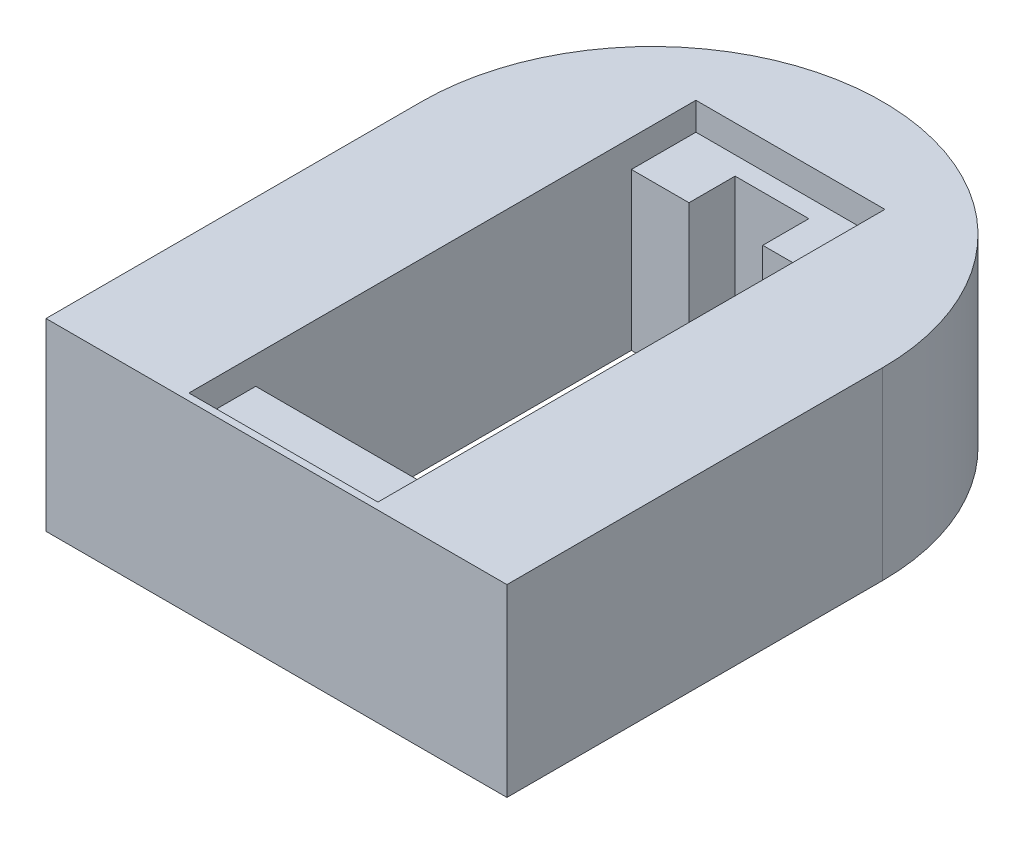
ISO-10303-21;
HEADER;
FILE_DESCRIPTION(('STEP AP214'),'2;1');
FILE_NAME('part.step','',(''),(''),'','','');
FILE_SCHEMA(('AUTOMOTIVE_DESIGN { 1 0 10303 214 1 1 1 1 }'));
ENDSEC;
DATA;
#1=APPLICATION_CONTEXT('core data for automotive mechanical design processes');
#2=APPLICATION_PROTOCOL_DEFINITION('international standard','automotive_design',2000,#1);
#3=PRODUCT_CONTEXT('',#1,'mechanical');
#4=PRODUCT('Part','Part','',(#3));
#5=PRODUCT_RELATED_PRODUCT_CATEGORY('part','',(#4));
#6=PRODUCT_DEFINITION_FORMATION('','',#4);
#7=PRODUCT_DEFINITION_CONTEXT('part definition',#1,'design');
#8=PRODUCT_DEFINITION('design','',#6,#7);
#9=PRODUCT_DEFINITION_SHAPE('','',#8);
#10=(LENGTH_UNIT() NAMED_UNIT(*) SI_UNIT(.MILLI.,.METRE.));
#11=(NAMED_UNIT(*) PLANE_ANGLE_UNIT() SI_UNIT($,.RADIAN.));
#12=(NAMED_UNIT(*) SI_UNIT($,.STERADIAN.) SOLID_ANGLE_UNIT());
#13=UNCERTAINTY_MEASURE_WITH_UNIT(LENGTH_MEASURE(1.E-05),#10,'distance_accuracy_value','');
#14=(GEOMETRIC_REPRESENTATION_CONTEXT(3) GLOBAL_UNCERTAINTY_ASSIGNED_CONTEXT((#13)) GLOBAL_UNIT_ASSIGNED_CONTEXT((#10,
#11,#12)) REPRESENTATION_CONTEXT('',''));
#15=CARTESIAN_POINT('',(0.,0.,0.));
#16=DIRECTION('',(0.,0.,1.));
#17=DIRECTION('',(1.,0.,0.));
#18=AXIS2_PLACEMENT_3D('',#15,#16,#17);
#19=CARTESIAN_POINT('',(0.,20.,0.));
#20=DIRECTION('',(-1.,0.,0.));
#21=DIRECTION('',(0.,0.,1.));
#22=AXIS2_PLACEMENT_3D('',#19,#20,#21);
#23=PLANE('',#22);
#24=DIRECTION('',(0.,0.,-1.));
#25=VECTOR('',#24,1.);
#26=CARTESIAN_POINT('',(0.,0.,0.));
#27=LINE('',#26,#25);
#28=CARTESIAN_POINT('',(0.,0.,0.));
#29=VERTEX_POINT('',#28);
#30=CARTESIAN_POINT('',(0.,0.,-40.75));
#31=VERTEX_POINT('',#30);
#32=EDGE_CURVE('E271',#29,#31,#27,.T.);
#33=ORIENTED_EDGE('',*,*,#32,.F.);
#34=DIRECTION('',(0.,-1.,0.));
#35=VECTOR('',#34,1.);
#36=CARTESIAN_POINT('',(0.,20.,0.));
#37=LINE('',#36,#35);
#38=CARTESIAN_POINT('',(0.,20.,0.));
#39=VERTEX_POINT('',#38);
#40=EDGE_CURVE('E11',#39,#29,#37,.T.);
#41=ORIENTED_EDGE('',*,*,#40,.F.);
#42=DIRECTION('',(0.,0.,-1.));
#43=VECTOR('',#42,1.);
#44=CARTESIAN_POINT('',(0.,20.,0.));
#45=LINE('',#44,#43);
#46=CARTESIAN_POINT('',(0.,20.,-40.75));
#47=VERTEX_POINT('',#46);
#48=EDGE_CURVE('E298',#39,#47,#45,.T.);
#49=ORIENTED_EDGE('',*,*,#48,.T.);
#50=DIRECTION('',(0.,-1.,0.));
#51=VECTOR('',#50,1.);
#52=CARTESIAN_POINT('',(0.,20.,-40.75));
#53=LINE('',#52,#51);
#54=EDGE_CURVE('E46',#47,#31,#53,.T.);
#55=ORIENTED_EDGE('',*,*,#54,.T.);
#56=EDGE_LOOP('',(#33,#41,#49,#55));
#57=FACE_BOUND('',#56,.T.);
#58=ADVANCED_FACE('F43',(#57),#23,.T.);
#59=CARTESIAN_POINT('',(0.,20.,0.));
#60=DIRECTION('',(0.,0.,-1.));
#61=DIRECTION('',(-1.,0.,0.));
#62=AXIS2_PLACEMENT_3D('',#59,#60,#61);
#63=PLANE('',#62);
#64=DIRECTION('',(1.,0.,0.));
#65=VECTOR('',#64,1.);
#66=CARTESIAN_POINT('',(0.,0.,0.));
#67=LINE('',#66,#65);
#68=CARTESIAN_POINT('',(50.,0.,0.));
#69=VERTEX_POINT('',#68);
#70=EDGE_CURVE('E303',#29,#69,#67,.T.);
#71=ORIENTED_EDGE('',*,*,#70,.T.);
#72=DIRECTION('',(0.,-1.,0.));
#73=VECTOR('',#72,1.);
#74=CARTESIAN_POINT('',(50.,20.,0.));
#75=LINE('',#74,#73);
#76=CARTESIAN_POINT('',(50.,20.,0.));
#77=VERTEX_POINT('',#76);
#78=EDGE_CURVE('E52',#77,#69,#75,.T.);
#79=ORIENTED_EDGE('',*,*,#78,.F.);
#80=DIRECTION('',(1.,0.,0.));
#81=VECTOR('',#80,1.);
#82=CARTESIAN_POINT('',(0.,20.,0.));
#83=LINE('',#82,#81);
#84=EDGE_CURVE('E310',#39,#77,#83,.T.);
#85=ORIENTED_EDGE('',*,*,#84,.F.);
#86=ORIENTED_EDGE('',*,*,#40,.T.);
#87=EDGE_LOOP('',(#71,#79,#85,#86));
#88=FACE_BOUND('',#87,.T.);
#89=ADVANCED_FACE('F345',(#88),#63,.F.);
#90=CARTESIAN_POINT('',(50.,20.,0.));
#91=DIRECTION('',(-1.,0.,0.));
#92=DIRECTION('',(0.,0.,1.));
#93=AXIS2_PLACEMENT_3D('',#90,#91,#92);
#94=PLANE('',#93);
#95=DIRECTION('',(0.,0.,-1.));
#96=VECTOR('',#95,1.);
#97=CARTESIAN_POINT('',(50.,0.,0.));
#98=LINE('',#97,#96);
#99=CARTESIAN_POINT('',(50.,0.,-40.75));
#100=VERTEX_POINT('',#99);
#101=EDGE_CURVE('E320',#69,#100,#98,.T.);
#102=ORIENTED_EDGE('',*,*,#101,.T.);
#103=DIRECTION('',(0.,-1.,0.));
#104=VECTOR('',#103,1.);
#105=CARTESIAN_POINT('',(50.,20.,-40.75));
#106=LINE('',#105,#104);
#107=CARTESIAN_POINT('',(50.,20.,-40.75));
#108=VERTEX_POINT('',#107);
#109=EDGE_CURVE('E328',#108,#100,#106,.T.);
#110=ORIENTED_EDGE('',*,*,#109,.F.);
#111=DIRECTION('',(0.,0.,-1.));
#112=VECTOR('',#111,1.);
#113=CARTESIAN_POINT('',(50.,20.,0.));
#114=LINE('',#113,#112);
#115=EDGE_CURVE('E307',#77,#108,#114,.T.);
#116=ORIENTED_EDGE('',*,*,#115,.F.);
#117=ORIENTED_EDGE('',*,*,#78,.T.);
#118=EDGE_LOOP('',(#102,#110,#116,#117));
#119=FACE_BOUND('',#118,.T.);
#120=ADVANCED_FACE('F349',(#119),#94,.F.);
#121=CARTESIAN_POINT('',(25.,20.,-40.75));
#122=DIRECTION('',(0.,-1.,0.));
#123=DIRECTION('',(0.,0.,-1.));
#124=AXIS2_PLACEMENT_3D('',#121,#122,#123);
#125=CYLINDRICAL_SURFACE('',#124,25.);
#126=CARTESIAN_POINT('',(25.,0.,-40.75));
#127=DIRECTION('',(0.,-1.,0.));
#128=DIRECTION('',(0.,0.,-1.));
#129=AXIS2_PLACEMENT_3D('',#126,#127,#128);
#130=CIRCLE('',#129,25.);
#131=EDGE_CURVE('E316',#31,#100,#130,.T.);
#132=ORIENTED_EDGE('',*,*,#131,.F.);
#133=ORIENTED_EDGE('',*,*,#54,.F.);
#134=CARTESIAN_POINT('',(25.,20.,-40.75));
#135=DIRECTION('',(0.,-1.,0.));
#136=DIRECTION('',(0.,0.,-1.));
#137=AXIS2_PLACEMENT_3D('',#134,#135,#136);
#138=CIRCLE('',#137,25.);
#139=EDGE_CURVE('E302',#47,#108,#138,.T.);
#140=ORIENTED_EDGE('',*,*,#139,.T.);
#141=ORIENTED_EDGE('',*,*,#109,.T.);
#142=EDGE_LOOP('',(#132,#133,#140,#141));
#143=FACE_BOUND('',#142,.T.);
#144=ADVANCED_FACE('F338',(#143),#125,.T.);
#145=CARTESIAN_POINT('',(25.,20.,-40.75));
#146=DIRECTION('',(0.,-1.,0.));
#147=DIRECTION('',(0.,0.,-1.));
#148=AXIS2_PLACEMENT_3D('',#145,#146,#147);
#149=PLANE('',#148);
#150=DIRECTION('',(0.,0.,1.));
#151=VECTOR('',#150,1.);
#152=CARTESIAN_POINT('',(14.75,20.,-48.75));
#153=LINE('',#152,#151);
#154=CARTESIAN_POINT('',(14.75,20.,-55.75));
#155=VERTEX_POINT('',#154);
#156=CARTESIAN_POINT('',(14.75,20.,-0.75));
#157=VERTEX_POINT('',#156);
#158=EDGE_CURVE('E229',#155,#157,#153,.T.);
#159=ORIENTED_EDGE('',*,*,#158,.F.);
#160=DIRECTION('',(-1.,0.,0.));
#161=VECTOR('',#160,1.);
#162=CARTESIAN_POINT('',(14.75,20.,-55.75));
#163=LINE('',#162,#161);
#164=CARTESIAN_POINT('',(35.25,20.,-55.75));
#165=VERTEX_POINT('',#164);
#166=EDGE_CURVE('E189',#165,#155,#163,.T.);
#167=ORIENTED_EDGE('',*,*,#166,.F.);
#168=DIRECTION('',(0.,0.,-1.));
#169=VECTOR('',#168,1.);
#170=CARTESIAN_POINT('',(35.25,20.,-8.));
#171=LINE('',#170,#169);
#172=CARTESIAN_POINT('',(35.25,20.,-0.75));
#173=VERTEX_POINT('',#172);
#174=EDGE_CURVE('E161',#173,#165,#171,.T.);
#175=ORIENTED_EDGE('',*,*,#174,.F.);
#176=DIRECTION('',(1.,0.,0.));
#177=VECTOR('',#176,1.);
#178=CARTESIAN_POINT('',(14.75,20.,-0.75));
#179=LINE('',#178,#177);
#180=EDGE_CURVE('E192',#157,#173,#179,.T.);
#181=ORIENTED_EDGE('',*,*,#180,.F.);
#182=EDGE_LOOP('',(#159,#167,#175,#181));
#183=FACE_BOUND('',#182,.T.);
#184=ORIENTED_EDGE('',*,*,#48,.F.);
#185=ORIENTED_EDGE('',*,*,#84,.T.);
#186=ORIENTED_EDGE('',*,*,#115,.T.);
#187=ORIENTED_EDGE('',*,*,#139,.F.);
#188=EDGE_LOOP('',(#184,#185,#186,#187));
#189=FACE_BOUND('',#188,.T.);
#190=ADVANCED_FACE('F351',(#183,#189),#149,.F.);
#191=CARTESIAN_POINT('',(25.,0.,-40.75));
#192=DIRECTION('',(0.,-1.,0.));
#193=DIRECTION('',(0.,0.,-1.));
#194=AXIS2_PLACEMENT_3D('',#191,#192,#193);
#195=PLANE('',#194);
#196=DIRECTION('',(0.,0.,1.));
#197=VECTOR('',#196,1.);
#198=CARTESIAN_POINT('',(14.75,0.,-48.75));
#199=LINE('',#198,#197);
#200=CARTESIAN_POINT('',(14.75,0.,-48.75));
#201=VERTEX_POINT('',#200);
#202=CARTESIAN_POINT('',(14.75,0.,-8.));
#203=VERTEX_POINT('',#202);
#204=EDGE_CURVE('E230',#201,#203,#199,.T.);
#205=ORIENTED_EDGE('',*,*,#204,.T.);
#206=DIRECTION('',(1.,0.,0.));
#207=VECTOR('',#206,1.);
#208=CARTESIAN_POINT('',(14.75,0.,-8.));
#209=LINE('',#208,#207);
#210=CARTESIAN_POINT('',(35.25,0.,-8.));
#211=VERTEX_POINT('',#210);
#212=EDGE_CURVE('E234',#203,#211,#209,.T.);
#213=ORIENTED_EDGE('',*,*,#212,.T.);
#214=DIRECTION('',(0.,0.,-1.));
#215=VECTOR('',#214,1.);
#216=CARTESIAN_POINT('',(35.25,0.,-8.));
#217=LINE('',#216,#215);
#218=CARTESIAN_POINT('',(35.25,0.,-48.75));
#219=VERTEX_POINT('',#218);
#220=EDGE_CURVE('E238',#211,#219,#217,.T.);
#221=ORIENTED_EDGE('',*,*,#220,.T.);
#222=DIRECTION('',(-1.,0.,0.));
#223=VECTOR('',#222,1.);
#224=CARTESIAN_POINT('',(29.,0.,-48.75));
#225=LINE('',#224,#223);
#226=CARTESIAN_POINT('',(29.,0.,-48.75));
#227=VERTEX_POINT('',#226);
#228=EDGE_CURVE('E242',#219,#227,#225,.T.);
#229=ORIENTED_EDGE('',*,*,#228,.T.);
#230=DIRECTION('',(0.,0.,-1.));
#231=VECTOR('',#230,1.);
#232=CARTESIAN_POINT('',(29.,0.,-53.75));
#233=LINE('',#232,#231);
#234=CARTESIAN_POINT('',(29.,0.,-53.75));
#235=VERTEX_POINT('',#234);
#236=EDGE_CURVE('E246',#227,#235,#233,.T.);
#237=ORIENTED_EDGE('',*,*,#236,.T.);
#238=DIRECTION('',(-1.,0.,0.));
#239=VECTOR('',#238,1.);
#240=CARTESIAN_POINT('',(21.,0.,-53.75));
#241=LINE('',#240,#239);
#242=CARTESIAN_POINT('',(21.,0.,-53.75));
#243=VERTEX_POINT('',#242);
#244=EDGE_CURVE('E250',#235,#243,#241,.T.);
#245=ORIENTED_EDGE('',*,*,#244,.T.);
#246=DIRECTION('',(0.,0.,1.));
#247=VECTOR('',#246,1.);
#248=CARTESIAN_POINT('',(21.,0.,-48.75));
#249=LINE('',#248,#247);
#250=CARTESIAN_POINT('',(21.,0.,-48.75));
#251=VERTEX_POINT('',#250);
#252=EDGE_CURVE('E254',#243,#251,#249,.T.);
#253=ORIENTED_EDGE('',*,*,#252,.T.);
#254=DIRECTION('',(-1.,0.,0.));
#255=VECTOR('',#254,1.);
#256=CARTESIAN_POINT('',(14.75,0.,-48.75));
#257=LINE('',#256,#255);
#258=EDGE_CURVE('E258',#251,#201,#257,.T.);
#259=ORIENTED_EDGE('',*,*,#258,.T.);
#260=EDGE_LOOP('',(#205,#213,#221,#229,#237,#245,#253,#259));
#261=FACE_BOUND('',#260,.T.);
#262=ORIENTED_EDGE('',*,*,#32,.T.);
#263=ORIENTED_EDGE('',*,*,#131,.T.);
#264=ORIENTED_EDGE('',*,*,#101,.F.);
#265=ORIENTED_EDGE('',*,*,#70,.F.);
#266=EDGE_LOOP('',(#262,#263,#264,#265));
#267=FACE_BOUND('',#266,.T.);
#268=ADVANCED_FACE('F342',(#261,#267),#195,.T.);
#269=CARTESIAN_POINT('',(14.75,0.,-48.75));
#270=DIRECTION('',(-1.,0.,0.));
#271=DIRECTION('',(0.,0.,1.));
#272=AXIS2_PLACEMENT_3D('',#269,#270,#271);
#273=PLANE('',#272);
#274=ORIENTED_EDGE('',*,*,#158,.T.);
#275=DIRECTION('',(0.,1.,0.));
#276=VECTOR('',#275,1.);
#277=CARTESIAN_POINT('',(14.75,17.,-0.75));
#278=LINE('',#277,#276);
#279=CARTESIAN_POINT('',(14.75,17.,-0.75));
#280=VERTEX_POINT('',#279);
#281=EDGE_CURVE('E196',#280,#157,#278,.T.);
#282=ORIENTED_EDGE('',*,*,#281,.F.);
#283=DIRECTION('',(0.,0.,1.));
#284=VECTOR('',#283,1.);
#285=CARTESIAN_POINT('',(14.75,17.,-8.));
#286=LINE('',#285,#284);
#287=CARTESIAN_POINT('',(14.75,17.,-8.));
#288=VERTEX_POINT('',#287);
#289=EDGE_CURVE('E209',#288,#280,#286,.T.);
#290=ORIENTED_EDGE('',*,*,#289,.F.);
#291=DIRECTION('',(0.,1.,0.));
#292=VECTOR('',#291,1.);
#293=CARTESIAN_POINT('',(14.75,0.,-8.));
#294=LINE('',#293,#292);
#295=EDGE_CURVE('E262',#203,#288,#294,.T.);
#296=ORIENTED_EDGE('',*,*,#295,.F.);
#297=ORIENTED_EDGE('',*,*,#204,.F.);
#298=DIRECTION('',(0.,1.,0.));
#299=VECTOR('',#298,1.);
#300=CARTESIAN_POINT('',(14.75,0.,-48.75));
#301=LINE('',#300,#299);
#302=CARTESIAN_POINT('',(14.75,17.,-48.75));
#303=VERTEX_POINT('',#302);
#304=EDGE_CURVE('E267',#201,#303,#301,.T.);
#305=ORIENTED_EDGE('',*,*,#304,.T.);
#306=DIRECTION('',(0.,0.,1.));
#307=VECTOR('',#306,1.);
#308=CARTESIAN_POINT('',(14.75,17.,-48.75));
#309=LINE('',#308,#307);
#310=CARTESIAN_POINT('',(14.75,17.,-55.75));
#311=VERTEX_POINT('',#310);
#312=EDGE_CURVE('E167',#311,#303,#309,.T.);
#313=ORIENTED_EDGE('',*,*,#312,.F.);
#314=DIRECTION('',(0.,1.,0.));
#315=VECTOR('',#314,1.);
#316=CARTESIAN_POINT('',(14.75,17.,-55.75));
#317=LINE('',#316,#315);
#318=EDGE_CURVE('E166',#311,#155,#317,.T.);
#319=ORIENTED_EDGE('',*,*,#318,.T.);
#320=EDGE_LOOP('',(#274,#282,#290,#296,#297,#305,#313,#319));
#321=FACE_BOUND('',#320,.T.);
#322=ADVANCED_FACE('F359',(#321),#273,.F.);
#323=CARTESIAN_POINT('',(14.75,0.,-48.75));
#324=DIRECTION('',(0.,0.,-1.));
#325=DIRECTION('',(-1.,0.,0.));
#326=AXIS2_PLACEMENT_3D('',#323,#324,#325);
#327=PLANE('',#326);
#328=DIRECTION('',(0.,1.,0.));
#329=VECTOR('',#328,1.);
#330=CARTESIAN_POINT('',(21.,0.,-48.75));
#331=LINE('',#330,#329);
#332=CARTESIAN_POINT('',(21.,17.,-48.75));
#333=VERTEX_POINT('',#332);
#334=EDGE_CURVE('E272',#251,#333,#331,.T.);
#335=ORIENTED_EDGE('',*,*,#334,.T.);
#336=DIRECTION('',(1.,0.,0.));
#337=VECTOR('',#336,1.);
#338=CARTESIAN_POINT('',(14.75,17.,-48.75));
#339=LINE('',#338,#337);
#340=EDGE_CURVE('E182',#303,#333,#339,.T.);
#341=ORIENTED_EDGE('',*,*,#340,.F.);
#342=ORIENTED_EDGE('',*,*,#304,.F.);
#343=ORIENTED_EDGE('',*,*,#258,.F.);
#344=EDGE_LOOP('',(#335,#341,#342,#343));
#345=FACE_BOUND('',#344,.T.);
#346=ADVANCED_FACE('F401',(#345),#327,.F.);
#347=CARTESIAN_POINT('',(21.,0.,-48.75));
#348=DIRECTION('',(-1.,0.,0.));
#349=DIRECTION('',(0.,0.,1.));
#350=AXIS2_PLACEMENT_3D('',#347,#348,#349);
#351=PLANE('',#350);
#352=DIRECTION('',(0.,1.,0.));
#353=VECTOR('',#352,1.);
#354=CARTESIAN_POINT('',(21.,0.,-53.75));
#355=LINE('',#354,#353);
#356=CARTESIAN_POINT('',(21.,17.,-53.75));
#357=VERTEX_POINT('',#356);
#358=EDGE_CURVE('E276',#243,#357,#355,.T.);
#359=ORIENTED_EDGE('',*,*,#358,.T.);
#360=DIRECTION('',(0.,0.,1.));
#361=VECTOR('',#360,1.);
#362=CARTESIAN_POINT('',(21.,17.,-48.75));
#363=LINE('',#362,#361);
#364=EDGE_CURVE('E225',#357,#333,#363,.T.);
#365=ORIENTED_EDGE('',*,*,#364,.T.);
#366=ORIENTED_EDGE('',*,*,#334,.F.);
#367=ORIENTED_EDGE('',*,*,#252,.F.);
#368=EDGE_LOOP('',(#359,#365,#366,#367));
#369=FACE_BOUND('',#368,.T.);
#370=ADVANCED_FACE('F412',(#369),#351,.F.);
#371=CARTESIAN_POINT('',(21.,0.,-53.75));
#372=DIRECTION('',(0.,0.,-1.));
#373=DIRECTION('',(-1.,0.,0.));
#374=AXIS2_PLACEMENT_3D('',#371,#372,#373);
#375=PLANE('',#374);
#376=DIRECTION('',(0.,1.,0.));
#377=VECTOR('',#376,1.);
#378=CARTESIAN_POINT('',(29.,0.,-53.75));
#379=LINE('',#378,#377);
#380=CARTESIAN_POINT('',(29.,17.,-53.75));
#381=VERTEX_POINT('',#380);
#382=EDGE_CURVE('E280',#235,#381,#379,.T.);
#383=ORIENTED_EDGE('',*,*,#382,.T.);
#384=DIRECTION('',(-1.,0.,0.));
#385=VECTOR('',#384,1.);
#386=CARTESIAN_POINT('',(21.,17.,-53.75));
#387=LINE('',#386,#385);
#388=EDGE_CURVE('E221',#381,#357,#387,.T.);
#389=ORIENTED_EDGE('',*,*,#388,.T.);
#390=ORIENTED_EDGE('',*,*,#358,.F.);
#391=ORIENTED_EDGE('',*,*,#244,.F.);
#392=EDGE_LOOP('',(#383,#389,#390,#391));
#393=FACE_BOUND('',#392,.T.);
#394=ADVANCED_FACE('F423',(#393),#375,.F.);
#395=CARTESIAN_POINT('',(29.,0.,-53.75));
#396=DIRECTION('',(1.,0.,0.));
#397=DIRECTION('',(0.,0.,-1.));
#398=AXIS2_PLACEMENT_3D('',#395,#396,#397);
#399=PLANE('',#398);
#400=DIRECTION('',(0.,1.,0.));
#401=VECTOR('',#400,1.);
#402=CARTESIAN_POINT('',(29.,0.,-48.75));
#403=LINE('',#402,#401);
#404=CARTESIAN_POINT('',(29.,17.,-48.75));
#405=VERTEX_POINT('',#404);
#406=EDGE_CURVE('E284',#227,#405,#403,.T.);
#407=ORIENTED_EDGE('',*,*,#406,.T.);
#408=DIRECTION('',(0.,0.,-1.));
#409=VECTOR('',#408,1.);
#410=CARTESIAN_POINT('',(29.,17.,-53.75));
#411=LINE('',#410,#409);
#412=EDGE_CURVE('E194',#405,#381,#411,.T.);
#413=ORIENTED_EDGE('',*,*,#412,.T.);
#414=ORIENTED_EDGE('',*,*,#382,.F.);
#415=ORIENTED_EDGE('',*,*,#236,.F.);
#416=EDGE_LOOP('',(#407,#413,#414,#415));
#417=FACE_BOUND('',#416,.T.);
#418=ADVANCED_FACE('F434',(#417),#399,.F.);
#419=CARTESIAN_POINT('',(29.,0.,-48.75));
#420=DIRECTION('',(0.,0.,-1.));
#421=DIRECTION('',(-1.,0.,0.));
#422=AXIS2_PLACEMENT_3D('',#419,#420,#421);
#423=PLANE('',#422);
#424=DIRECTION('',(0.,1.,0.));
#425=VECTOR('',#424,1.);
#426=CARTESIAN_POINT('',(35.25,0.,-48.75));
#427=LINE('',#426,#425);
#428=CARTESIAN_POINT('',(35.25,17.,-48.75));
#429=VERTEX_POINT('',#428);
#430=EDGE_CURVE('E288',#219,#429,#427,.T.);
#431=ORIENTED_EDGE('',*,*,#430,.T.);
#432=EDGE_CURVE('E179',#405,#429,#339,.T.);
#433=ORIENTED_EDGE('',*,*,#432,.F.);
#434=ORIENTED_EDGE('',*,*,#406,.F.);
#435=ORIENTED_EDGE('',*,*,#228,.F.);
#436=EDGE_LOOP('',(#431,#433,#434,#435));
#437=FACE_BOUND('',#436,.T.);
#438=ADVANCED_FACE('F445',(#437),#423,.F.);
#439=CARTESIAN_POINT('',(35.25,0.,-8.));
#440=DIRECTION('',(1.,0.,0.));
#441=DIRECTION('',(0.,0.,-1.));
#442=AXIS2_PLACEMENT_3D('',#439,#440,#441);
#443=PLANE('',#442);
#444=ORIENTED_EDGE('',*,*,#174,.T.);
#445=DIRECTION('',(0.,1.,0.));
#446=VECTOR('',#445,1.);
#447=CARTESIAN_POINT('',(35.25,17.,-55.75));
#448=LINE('',#447,#446);
#449=CARTESIAN_POINT('',(35.25,17.,-55.75));
#450=VERTEX_POINT('',#449);
#451=EDGE_CURVE('E157',#450,#165,#448,.T.);
#452=ORIENTED_EDGE('',*,*,#451,.F.);
#453=DIRECTION('',(0.,0.,-1.));
#454=VECTOR('',#453,1.);
#455=CARTESIAN_POINT('',(35.25,17.,-55.75));
#456=LINE('',#455,#454);
#457=EDGE_CURVE('E60',#429,#450,#456,.T.);
#458=ORIENTED_EDGE('',*,*,#457,.F.);
#459=ORIENTED_EDGE('',*,*,#430,.F.);
#460=ORIENTED_EDGE('',*,*,#220,.F.);
#461=DIRECTION('',(0.,1.,0.));
#462=VECTOR('',#461,1.);
#463=CARTESIAN_POINT('',(35.25,0.,-8.));
#464=LINE('',#463,#462);
#465=CARTESIAN_POINT('',(35.25,17.,-8.));
#466=VERTEX_POINT('',#465);
#467=EDGE_CURVE('E291',#211,#466,#464,.T.);
#468=ORIENTED_EDGE('',*,*,#467,.T.);
#469=DIRECTION('',(0.,0.,-1.));
#470=VECTOR('',#469,1.);
#471=CARTESIAN_POINT('',(35.25,17.,-0.75));
#472=LINE('',#471,#470);
#473=CARTESIAN_POINT('',(35.25,17.,-0.75));
#474=VERTEX_POINT('',#473);
#475=EDGE_CURVE('E68',#474,#466,#472,.T.);
#476=ORIENTED_EDGE('',*,*,#475,.F.);
#477=DIRECTION('',(0.,1.,0.));
#478=VECTOR('',#477,1.);
#479=CARTESIAN_POINT('',(35.25,17.,-0.75));
#480=LINE('',#479,#478);
#481=EDGE_CURVE('E201',#474,#173,#480,.T.);
#482=ORIENTED_EDGE('',*,*,#481,.T.);
#483=EDGE_LOOP('',(#444,#452,#458,#459,#460,#468,#476,#482));
#484=FACE_BOUND('',#483,.T.);
#485=ADVANCED_FACE('F159',(#484),#443,.F.);
#486=CARTESIAN_POINT('',(14.75,0.,-8.));
#487=DIRECTION('',(0.,0.,1.));
#488=DIRECTION('',(1.,0.,0.));
#489=AXIS2_PLACEMENT_3D('',#486,#487,#488);
#490=PLANE('',#489);
#491=ORIENTED_EDGE('',*,*,#295,.T.);
#492=DIRECTION('',(-1.,0.,0.));
#493=VECTOR('',#492,1.);
#494=CARTESIAN_POINT('',(14.75,17.,-8.));
#495=LINE('',#494,#493);
#496=EDGE_CURVE('E213',#466,#288,#495,.T.);
#497=ORIENTED_EDGE('',*,*,#496,.F.);
#498=ORIENTED_EDGE('',*,*,#467,.F.);
#499=ORIENTED_EDGE('',*,*,#212,.F.);
#500=EDGE_LOOP('',(#491,#497,#498,#499));
#501=FACE_BOUND('',#500,.T.);
#502=ADVANCED_FACE('F467',(#501),#490,.F.);
#503=CARTESIAN_POINT('',(14.75,17.,-0.75));
#504=DIRECTION('',(0.,0.,1.));
#505=DIRECTION('',(1.,0.,0.));
#506=AXIS2_PLACEMENT_3D('',#503,#504,#505);
#507=PLANE('',#506);
#508=ORIENTED_EDGE('',*,*,#180,.T.);
#509=ORIENTED_EDGE('',*,*,#481,.F.);
#510=DIRECTION('',(1.,0.,0.));
#511=VECTOR('',#510,1.);
#512=CARTESIAN_POINT('',(14.75,17.,-0.75));
#513=LINE('',#512,#511);
#514=EDGE_CURVE('E200',#280,#474,#513,.T.);
#515=ORIENTED_EDGE('',*,*,#514,.F.);
#516=ORIENTED_EDGE('',*,*,#281,.T.);
#517=EDGE_LOOP('',(#508,#509,#515,#516));
#518=FACE_BOUND('',#517,.T.);
#519=ADVANCED_FACE('F477',(#518),#507,.F.);
#520=CARTESIAN_POINT('',(0.,17.,0.));
#521=DIRECTION('',(0.,-1.,0.));
#522=DIRECTION('',(0.,0.,-1.));
#523=AXIS2_PLACEMENT_3D('',#520,#521,#522);
#524=PLANE('',#523);
#525=ORIENTED_EDGE('',*,*,#475,.T.);
#526=ORIENTED_EDGE('',*,*,#496,.T.);
#527=ORIENTED_EDGE('',*,*,#289,.T.);
#528=ORIENTED_EDGE('',*,*,#514,.T.);
#529=EDGE_LOOP('',(#525,#526,#527,#528));
#530=FACE_BOUND('',#529,.T.);
#531=ADVANCED_FACE('F487',(#530),#524,.F.);
#532=CARTESIAN_POINT('',(0.,17.,0.));
#533=DIRECTION('',(0.,-1.,0.));
#534=DIRECTION('',(0.,0.,-1.));
#535=AXIS2_PLACEMENT_3D('',#532,#533,#534);
#536=PLANE('',#535);
#537=ORIENTED_EDGE('',*,*,#388,.F.);
#538=ORIENTED_EDGE('',*,*,#412,.F.);
#539=ORIENTED_EDGE('',*,*,#432,.T.);
#540=ORIENTED_EDGE('',*,*,#457,.T.);
#541=DIRECTION('',(-1.,0.,0.));
#542=VECTOR('',#541,1.);
#543=CARTESIAN_POINT('',(14.75,17.,-55.75));
#544=LINE('',#543,#542);
#545=EDGE_CURVE('E170',#450,#311,#544,.T.);
#546=ORIENTED_EDGE('',*,*,#545,.T.);
#547=ORIENTED_EDGE('',*,*,#312,.T.);
#548=ORIENTED_EDGE('',*,*,#340,.T.);
#549=ORIENTED_EDGE('',*,*,#364,.F.);
#550=EDGE_LOOP('',(#537,#538,#539,#540,#546,#547,#548,#549));
#551=FACE_BOUND('',#550,.T.);
#552=ADVANCED_FACE('F177',(#551),#536,.F.);
#553=CARTESIAN_POINT('',(14.75,17.,-55.75));
#554=DIRECTION('',(0.,0.,-1.));
#555=DIRECTION('',(-1.,0.,0.));
#556=AXIS2_PLACEMENT_3D('',#553,#554,#555);
#557=PLANE('',#556);
#558=ORIENTED_EDGE('',*,*,#166,.T.);
#559=ORIENTED_EDGE('',*,*,#318,.F.);
#560=ORIENTED_EDGE('',*,*,#545,.F.);
#561=ORIENTED_EDGE('',*,*,#451,.T.);
#562=EDGE_LOOP('',(#558,#559,#560,#561));
#563=FACE_BOUND('',#562,.T.);
#564=ADVANCED_FACE('F171',(#563),#557,.F.);
#565=CLOSED_SHELL('',(#58,#89,#120,#144,#190,#268,#322,#346,#370,#394,#418,#438,#485,#502,#519,
#531,#552,#564));
#566=MANIFOLD_SOLID_BREP('B2',#565);
#567=ADVANCED_BREP_SHAPE_REPRESENTATION('',(#18,#566),#14);
#568=SHAPE_DEFINITION_REPRESENTATION(#9,#567);
ENDSEC;
END-ISO-10303-21;
